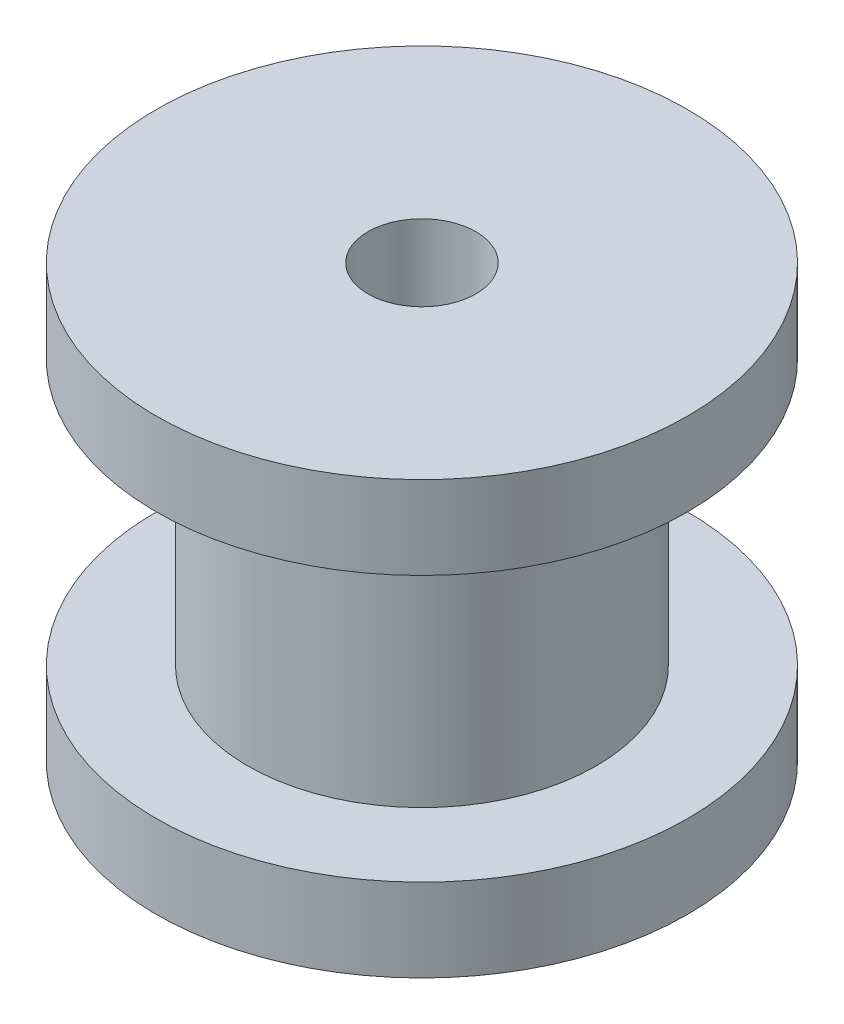
ISO-10303-21;
HEADER;
FILE_DESCRIPTION(('STEP AP214'),'2;1');
FILE_NAME('part.step','',(''),(''),'','','');
FILE_SCHEMA(('AUTOMOTIVE_DESIGN { 1 0 10303 214 1 1 1 1 }'));
ENDSEC;
DATA;
#1=APPLICATION_CONTEXT('core data for automotive mechanical design processes');
#2=APPLICATION_PROTOCOL_DEFINITION('international standard','automotive_design',2000,#1);
#3=PRODUCT_CONTEXT('',#1,'mechanical');
#4=PRODUCT('Part','Part','',(#3));
#5=PRODUCT_RELATED_PRODUCT_CATEGORY('part','',(#4));
#6=PRODUCT_DEFINITION_FORMATION('','',#4);
#7=PRODUCT_DEFINITION_CONTEXT('part definition',#1,'design');
#8=PRODUCT_DEFINITION('design','',#6,#7);
#9=PRODUCT_DEFINITION_SHAPE('','',#8);
#10=(LENGTH_UNIT() NAMED_UNIT(*) SI_UNIT(.MILLI.,.METRE.));
#11=(NAMED_UNIT(*) PLANE_ANGLE_UNIT() SI_UNIT($,.RADIAN.));
#12=(NAMED_UNIT(*) SI_UNIT($,.STERADIAN.) SOLID_ANGLE_UNIT());
#13=UNCERTAINTY_MEASURE_WITH_UNIT(LENGTH_MEASURE(1.E-05),#10,'distance_accuracy_value','');
#14=(GEOMETRIC_REPRESENTATION_CONTEXT(3) GLOBAL_UNCERTAINTY_ASSIGNED_CONTEXT((#13)) GLOBAL_UNIT_ASSIGNED_CONTEXT((#10,
#11,#12)) REPRESENTATION_CONTEXT('',''));
#15=CARTESIAN_POINT('',(0.,0.,0.));
#16=DIRECTION('',(0.,0.,1.));
#17=DIRECTION('',(1.,0.,0.));
#18=AXIS2_PLACEMENT_3D('',#15,#16,#17);
#19=CARTESIAN_POINT('',(8.,-6.5,0.));
#20=DIRECTION('',(0.,-1.,0.));
#21=DIRECTION('',(1.,0.,0.));
#22=AXIS2_PLACEMENT_3D('',#19,#20,#21);
#23=PLANE('',#22);
#24=CARTESIAN_POINT('',(0.,-6.5,0.));
#25=DIRECTION('',(0.,1.,0.));
#26=DIRECTION('',(-1.,0.,0.));
#27=AXIS2_PLACEMENT_3D('',#24,#25,#26);
#28=CIRCLE('',#27,1.625);
#29=CARTESIAN_POINT('',(-1.625,-6.5,0.));
#30=VERTEX_POINT('',#29);
#31=EDGE_CURVE('E74',#30,#30,#28,.T.);
#32=ORIENTED_EDGE('',*,*,#31,.T.);
#33=EDGE_LOOP('',(#32));
#34=FACE_BOUND('',#33,.T.);
#35=CARTESIAN_POINT('',(0.,-6.5,0.));
#36=DIRECTION('',(0.,-1.,0.));
#37=DIRECTION('',(1.,0.,0.));
#38=AXIS2_PLACEMENT_3D('',#35,#36,#37);
#39=CIRCLE('',#38,8.);
#40=CARTESIAN_POINT('',(8.,-6.5,0.));
#41=VERTEX_POINT('',#40);
#42=EDGE_CURVE('E70',#41,#41,#39,.T.);
#43=ORIENTED_EDGE('',*,*,#42,.T.);
#44=EDGE_LOOP('',(#43));
#45=FACE_BOUND('',#44,.T.);
#46=ADVANCED_FACE('F43',(#34,#45),#23,.T.);
#47=CARTESIAN_POINT('',(8.,6.5,0.));
#48=DIRECTION('',(0.,1.,0.));
#49=DIRECTION('',(-1.,0.,0.));
#50=AXIS2_PLACEMENT_3D('',#47,#48,#49);
#51=PLANE('',#50);
#52=CARTESIAN_POINT('',(0.,6.5,0.));
#53=DIRECTION('',(0.,1.,0.));
#54=DIRECTION('',(-1.,0.,0.));
#55=AXIS2_PLACEMENT_3D('',#52,#53,#54);
#56=CIRCLE('',#55,1.625);
#57=CARTESIAN_POINT('',(-1.625,6.5,0.));
#58=VERTEX_POINT('',#57);
#59=EDGE_CURVE('E75',#58,#58,#56,.T.);
#60=ORIENTED_EDGE('',*,*,#59,.F.);
#61=EDGE_LOOP('',(#60));
#62=FACE_BOUND('',#61,.T.);
#63=CARTESIAN_POINT('',(0.,6.5,0.));
#64=DIRECTION('',(0.,-1.,0.));
#65=DIRECTION('',(1.,0.,0.));
#66=AXIS2_PLACEMENT_3D('',#63,#64,#65);
#67=CIRCLE('',#66,8.);
#68=CARTESIAN_POINT('',(8.,6.5,0.));
#69=VERTEX_POINT('',#68);
#70=EDGE_CURVE('E10',#69,#69,#67,.T.);
#71=ORIENTED_EDGE('',*,*,#70,.F.);
#72=EDGE_LOOP('',(#71));
#73=FACE_BOUND('',#72,.T.);
#74=ADVANCED_FACE('F92',(#62,#73),#51,.T.);
#75=CARTESIAN_POINT('',(0.,-6.5,0.));
#76=DIRECTION('',(0.,-1.,0.));
#77=DIRECTION('',(1.,0.,0.));
#78=AXIS2_PLACEMENT_3D('',#75,#76,#77);
#79=CYLINDRICAL_SURFACE('',#78,8.);
#80=ORIENTED_EDGE('',*,*,#70,.T.);
#81=EDGE_LOOP('',(#80));
#82=FACE_BOUND('',#81,.T.);
#83=CARTESIAN_POINT('',(0.,4.,0.));
#84=DIRECTION('',(0.,-1.,0.));
#85=DIRECTION('',(1.,0.,0.));
#86=AXIS2_PLACEMENT_3D('',#83,#84,#85);
#87=CIRCLE('',#86,8.);
#88=CARTESIAN_POINT('',(8.,4.,0.));
#89=VERTEX_POINT('',#88);
#90=EDGE_CURVE('E50',#89,#89,#87,.T.);
#91=ORIENTED_EDGE('',*,*,#90,.F.);
#92=EDGE_LOOP('',(#91));
#93=FACE_BOUND('',#92,.T.);
#94=ADVANCED_FACE('F95',(#82,#93),#79,.T.);
#95=CARTESIAN_POINT('',(5.25,4.,0.));
#96=DIRECTION('',(0.,-1.,0.));
#97=DIRECTION('',(1.,0.,0.));
#98=AXIS2_PLACEMENT_3D('',#95,#96,#97);
#99=PLANE('',#98);
#100=ORIENTED_EDGE('',*,*,#90,.T.);
#101=EDGE_LOOP('',(#100));
#102=FACE_BOUND('',#101,.T.);
#103=CARTESIAN_POINT('',(0.,4.,0.));
#104=DIRECTION('',(0.,-1.,0.));
#105=DIRECTION('',(1.,0.,0.));
#106=AXIS2_PLACEMENT_3D('',#103,#104,#105);
#107=CIRCLE('',#106,5.25);
#108=CARTESIAN_POINT('',(5.25,4.,0.));
#109=VERTEX_POINT('',#108);
#110=EDGE_CURVE('E55',#109,#109,#107,.T.);
#111=ORIENTED_EDGE('',*,*,#110,.F.);
#112=EDGE_LOOP('',(#111));
#113=FACE_BOUND('',#112,.T.);
#114=ADVANCED_FACE('F100',(#102,#113),#99,.T.);
#115=CARTESIAN_POINT('',(0.,-6.5,0.));
#116=DIRECTION('',(0.,-1.,0.));
#117=DIRECTION('',(1.,0.,0.));
#118=AXIS2_PLACEMENT_3D('',#115,#116,#117);
#119=CYLINDRICAL_SURFACE('',#118,5.25);
#120=ORIENTED_EDGE('',*,*,#110,.T.);
#121=EDGE_LOOP('',(#120));
#122=FACE_BOUND('',#121,.T.);
#123=CARTESIAN_POINT('',(0.,-4.,0.));
#124=DIRECTION('',(0.,-1.,0.));
#125=DIRECTION('',(1.,0.,0.));
#126=AXIS2_PLACEMENT_3D('',#123,#124,#125);
#127=CIRCLE('',#126,5.25);
#128=CARTESIAN_POINT('',(5.25,-4.,0.));
#129=VERTEX_POINT('',#128);
#130=EDGE_CURVE('E60',#129,#129,#127,.T.);
#131=ORIENTED_EDGE('',*,*,#130,.F.);
#132=EDGE_LOOP('',(#131));
#133=FACE_BOUND('',#132,.T.);
#134=ADVANCED_FACE('F105',(#122,#133),#119,.T.);
#135=CARTESIAN_POINT('',(5.25,-4.,0.));
#136=DIRECTION('',(0.,1.,0.));
#137=DIRECTION('',(-1.,0.,0.));
#138=AXIS2_PLACEMENT_3D('',#135,#136,#137);
#139=PLANE('',#138);
#140=ORIENTED_EDGE('',*,*,#130,.T.);
#141=EDGE_LOOP('',(#140));
#142=FACE_BOUND('',#141,.T.);
#143=CARTESIAN_POINT('',(0.,-4.,0.));
#144=DIRECTION('',(0.,-1.,0.));
#145=DIRECTION('',(1.,0.,0.));
#146=AXIS2_PLACEMENT_3D('',#143,#144,#145);
#147=CIRCLE('',#146,8.);
#148=CARTESIAN_POINT('',(8.,-4.,0.));
#149=VERTEX_POINT('',#148);
#150=EDGE_CURVE('E66',#149,#149,#147,.T.);
#151=ORIENTED_EDGE('',*,*,#150,.F.);
#152=EDGE_LOOP('',(#151));
#153=FACE_BOUND('',#152,.T.);
#154=ADVANCED_FACE('F108',(#142,#153),#139,.T.);
#155=CARTESIAN_POINT('',(0.,-6.5,0.));
#156=DIRECTION('',(0.,-1.,0.));
#157=DIRECTION('',(1.,0.,0.));
#158=AXIS2_PLACEMENT_3D('',#155,#156,#157);
#159=CYLINDRICAL_SURFACE('',#158,8.);
#160=ORIENTED_EDGE('',*,*,#150,.T.);
#161=EDGE_LOOP('',(#160));
#162=FACE_BOUND('',#161,.T.);
#163=ORIENTED_EDGE('',*,*,#42,.F.);
#164=EDGE_LOOP('',(#163));
#165=FACE_BOUND('',#164,.T.);
#166=ADVANCED_FACE('F88',(#162,#165),#159,.T.);
#167=CARTESIAN_POINT('',(0.,-6.5,0.));
#168=DIRECTION('',(0.,1.,0.));
#169=DIRECTION('',(-1.,0.,0.));
#170=AXIS2_PLACEMENT_3D('',#167,#168,#169);
#171=CYLINDRICAL_SURFACE('',#170,1.625);
#172=ORIENTED_EDGE('',*,*,#31,.F.);
#173=EDGE_LOOP('',(#172));
#174=FACE_BOUND('',#173,.T.);
#175=ORIENTED_EDGE('',*,*,#59,.T.);
#176=EDGE_LOOP('',(#175));
#177=FACE_BOUND('',#176,.T.);
#178=ADVANCED_FACE('F85',(#174,#177),#171,.F.);
#179=CLOSED_SHELL('',(#46,#74,#94,#114,#134,#154,#166,#178));
#180=MANIFOLD_SOLID_BREP('B2',#179);
#181=ADVANCED_BREP_SHAPE_REPRESENTATION('',(#18,#180),#14);
#182=SHAPE_DEFINITION_REPRESENTATION(#9,#181);
ENDSEC;
END-ISO-10303-21;
